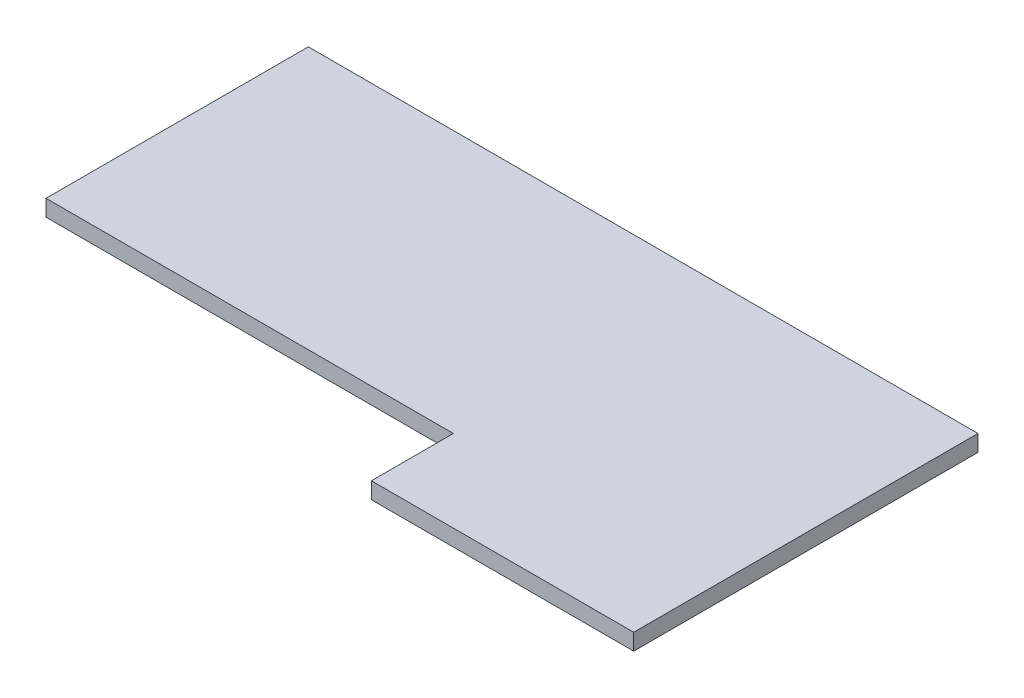
ISO-10303-21;
HEADER;
FILE_DESCRIPTION(('STEP AP214'),'2;1');
FILE_NAME('part.step','',(''),(''),'','','');
FILE_SCHEMA(('AUTOMOTIVE_DESIGN { 1 0 10303 214 1 1 1 1 }'));
ENDSEC;
DATA;
#1=APPLICATION_CONTEXT('core data for automotive mechanical design processes');
#2=APPLICATION_PROTOCOL_DEFINITION('international standard','automotive_design',2000,#1);
#3=PRODUCT_CONTEXT('',#1,'mechanical');
#4=PRODUCT('Part','Part','',(#3));
#5=PRODUCT_RELATED_PRODUCT_CATEGORY('part','',(#4));
#6=PRODUCT_DEFINITION_FORMATION('','',#4);
#7=PRODUCT_DEFINITION_CONTEXT('part definition',#1,'design');
#8=PRODUCT_DEFINITION('design','',#6,#7);
#9=PRODUCT_DEFINITION_SHAPE('','',#8);
#10=(LENGTH_UNIT() NAMED_UNIT(*) SI_UNIT(.MILLI.,.METRE.));
#11=(NAMED_UNIT(*) PLANE_ANGLE_UNIT() SI_UNIT($,.RADIAN.));
#12=(NAMED_UNIT(*) SI_UNIT($,.STERADIAN.) SOLID_ANGLE_UNIT());
#13=UNCERTAINTY_MEASURE_WITH_UNIT(LENGTH_MEASURE(1.E-05),#10,'distance_accuracy_value','');
#14=(GEOMETRIC_REPRESENTATION_CONTEXT(3) GLOBAL_UNCERTAINTY_ASSIGNED_CONTEXT((#13)) GLOBAL_UNIT_ASSIGNED_CONTEXT((#10,
#11,#12)) REPRESENTATION_CONTEXT('',''));
#15=CARTESIAN_POINT('',(0.,0.,0.));
#16=DIRECTION('',(0.,0.,1.));
#17=DIRECTION('',(1.,0.,0.));
#18=AXIS2_PLACEMENT_3D('',#15,#16,#17);
#19=CARTESIAN_POINT('',(-73.7839145142331,3.175,50.1154088181364));
#20=DIRECTION('',(1.,0.,0.));
#21=DIRECTION('',(0.,0.,-1.));
#22=AXIS2_PLACEMENT_3D('',#19,#20,#21);
#23=PLANE('',#22);
#24=DIRECTION('',(0.,0.,1.));
#25=VECTOR('',#24,1.);
#26=CARTESIAN_POINT('',(-73.7839145142331,0.,50.1154088181364));
#27=LINE('',#26,#25);
#28=CARTESIAN_POINT('',(-73.7839145142331,0.,-0.684591181863654));
#29=VERTEX_POINT('',#28);
#30=CARTESIAN_POINT('',(-73.7839145142331,0.,50.1154088181364));
#31=VERTEX_POINT('',#30);
#32=EDGE_CURVE('E129',#29,#31,#27,.T.);
#33=ORIENTED_EDGE('',*,*,#32,.T.);
#34=DIRECTION('',(0.,-1.,0.));
#35=VECTOR('',#34,1.);
#36=CARTESIAN_POINT('',(-73.7839145142331,3.175,50.1154088181364));
#37=LINE('',#36,#35);
#38=CARTESIAN_POINT('',(-73.7839145142331,3.175,50.1154088181364));
#39=VERTEX_POINT('',#38);
#40=EDGE_CURVE('E49',#39,#31,#37,.T.);
#41=ORIENTED_EDGE('',*,*,#40,.F.);
#42=DIRECTION('',(0.,0.,1.));
#43=VECTOR('',#42,1.);
#44=CARTESIAN_POINT('',(-73.7839145142331,3.175,50.1154088181364));
#45=LINE('',#44,#43);
#46=CARTESIAN_POINT('',(-73.7839145142331,3.175,-0.684591181863654));
#47=VERTEX_POINT('',#46);
#48=EDGE_CURVE('E95',#47,#39,#45,.T.);
#49=ORIENTED_EDGE('',*,*,#48,.F.);
#50=DIRECTION('',(0.,-1.,0.));
#51=VECTOR('',#50,1.);
#52=CARTESIAN_POINT('',(-73.7839145142331,3.175,-0.684591181863654));
#53=LINE('',#52,#51);
#54=EDGE_CURVE('E11',#47,#29,#53,.T.);
#55=ORIENTED_EDGE('',*,*,#54,.T.);
#56=EDGE_LOOP('',(#33,#41,#49,#55));
#57=FACE_BOUND('',#56,.T.);
#58=ADVANCED_FACE('F41',(#57),#23,.F.);
#59=CARTESIAN_POINT('',(5.0993337507725,3.175,50.1154088181364));
#60=DIRECTION('',(0.,0.,-1.));
#61=DIRECTION('',(-1.,0.,0.));
#62=AXIS2_PLACEMENT_3D('',#59,#60,#61);
#63=PLANE('',#62);
#64=DIRECTION('',(1.,0.,0.));
#65=VECTOR('',#64,1.);
#66=CARTESIAN_POINT('',(5.0993337507725,0.,50.1154088181364));
#67=LINE('',#66,#65);
#68=CARTESIAN_POINT('',(5.0993337507725,0.,50.1154088181364));
#69=VERTEX_POINT('',#68);
#70=EDGE_CURVE('E131',#31,#69,#67,.T.);
#71=ORIENTED_EDGE('',*,*,#70,.T.);
#72=DIRECTION('',(0.,-1.,0.));
#73=VECTOR('',#72,1.);
#74=CARTESIAN_POINT('',(5.0993337507725,3.175,50.1154088181364));
#75=LINE('',#74,#73);
#76=CARTESIAN_POINT('',(5.0993337507725,3.175,50.1154088181364));
#77=VERTEX_POINT('',#76);
#78=EDGE_CURVE('E118',#77,#69,#75,.T.);
#79=ORIENTED_EDGE('',*,*,#78,.F.);
#80=DIRECTION('',(1.,0.,0.));
#81=VECTOR('',#80,1.);
#82=CARTESIAN_POINT('',(5.0993337507725,3.175,50.1154088181364));
#83=LINE('',#82,#81);
#84=EDGE_CURVE('E109',#39,#77,#83,.T.);
#85=ORIENTED_EDGE('',*,*,#84,.F.);
#86=ORIENTED_EDGE('',*,*,#40,.T.);
#87=EDGE_LOOP('',(#71,#79,#85,#86));
#88=FACE_BOUND('',#87,.T.);
#89=ADVANCED_FACE('F143',(#88),#63,.F.);
#90=CARTESIAN_POINT('',(5.0993337507725,3.175,65.9904088181364));
#91=DIRECTION('',(1.,0.,0.));
#92=DIRECTION('',(0.,0.,-1.));
#93=AXIS2_PLACEMENT_3D('',#90,#91,#92);
#94=PLANE('',#93);
#95=DIRECTION('',(0.,0.,1.));
#96=VECTOR('',#95,1.);
#97=CARTESIAN_POINT('',(5.0993337507725,0.,65.9904088181364));
#98=LINE('',#97,#96);
#99=CARTESIAN_POINT('',(5.0993337507725,0.,65.9904088181364));
#100=VERTEX_POINT('',#99);
#101=EDGE_CURVE('E117',#69,#100,#98,.T.);
#102=ORIENTED_EDGE('',*,*,#101,.T.);
#103=DIRECTION('',(0.,-1.,0.));
#104=VECTOR('',#103,1.);
#105=CARTESIAN_POINT('',(5.0993337507725,3.175,65.9904088181364));
#106=LINE('',#105,#104);
#107=CARTESIAN_POINT('',(5.0993337507725,3.175,65.9904088181364));
#108=VERTEX_POINT('',#107);
#109=EDGE_CURVE('E114',#108,#100,#106,.T.);
#110=ORIENTED_EDGE('',*,*,#109,.F.);
#111=DIRECTION('',(0.,0.,1.));
#112=VECTOR('',#111,1.);
#113=CARTESIAN_POINT('',(5.0993337507725,3.175,65.9904088181364));
#114=LINE('',#113,#112);
#115=EDGE_CURVE('E103',#77,#108,#114,.T.);
#116=ORIENTED_EDGE('',*,*,#115,.F.);
#117=ORIENTED_EDGE('',*,*,#78,.T.);
#118=EDGE_LOOP('',(#102,#110,#116,#117));
#119=FACE_BOUND('',#118,.T.);
#120=ADVANCED_FACE('F115',(#119),#94,.F.);
#121=CARTESIAN_POINT('',(55.8993337507725,3.175,65.9904088181364));
#122=DIRECTION('',(0.,0.,-1.));
#123=DIRECTION('',(-1.,0.,0.));
#124=AXIS2_PLACEMENT_3D('',#121,#122,#123);
#125=PLANE('',#124);
#126=DIRECTION('',(1.,0.,0.));
#127=VECTOR('',#126,1.);
#128=CARTESIAN_POINT('',(55.8993337507725,0.,65.9904088181364));
#129=LINE('',#128,#127);
#130=CARTESIAN_POINT('',(55.8993337507725,0.,65.9904088181364));
#131=VERTEX_POINT('',#130);
#132=EDGE_CURVE('E81',#100,#131,#129,.T.);
#133=ORIENTED_EDGE('',*,*,#132,.T.);
#134=DIRECTION('',(0.,-1.,0.));
#135=VECTOR('',#134,1.);
#136=CARTESIAN_POINT('',(55.8993337507725,3.175,65.9904088181364));
#137=LINE('',#136,#135);
#138=CARTESIAN_POINT('',(55.8993337507725,3.175,65.9904088181364));
#139=VERTEX_POINT('',#138);
#140=EDGE_CURVE('E119',#139,#131,#137,.T.);
#141=ORIENTED_EDGE('',*,*,#140,.F.);
#142=DIRECTION('',(1.,0.,0.));
#143=VECTOR('',#142,1.);
#144=CARTESIAN_POINT('',(55.8993337507725,3.175,65.9904088181364));
#145=LINE('',#144,#143);
#146=EDGE_CURVE('E107',#108,#139,#145,.T.);
#147=ORIENTED_EDGE('',*,*,#146,.F.);
#148=ORIENTED_EDGE('',*,*,#109,.T.);
#149=EDGE_LOOP('',(#133,#141,#147,#148));
#150=FACE_BOUND('',#149,.T.);
#151=ADVANCED_FACE('F121',(#150),#125,.F.);
#152=CARTESIAN_POINT('',(55.8993337507725,3.175,-0.684591181863634));
#153=DIRECTION('',(-1.,0.,0.));
#154=DIRECTION('',(0.,0.,1.));
#155=AXIS2_PLACEMENT_3D('',#152,#153,#154);
#156=PLANE('',#155);
#157=DIRECTION('',(0.,0.,-1.));
#158=VECTOR('',#157,1.);
#159=CARTESIAN_POINT('',(55.8993337507725,0.,-0.684591181863634));
#160=LINE('',#159,#158);
#161=CARTESIAN_POINT('',(55.8993337507725,0.,-0.684591181863634));
#162=VERTEX_POINT('',#161);
#163=EDGE_CURVE('E88',#131,#162,#160,.T.);
#164=ORIENTED_EDGE('',*,*,#163,.T.);
#165=DIRECTION('',(0.,-1.,0.));
#166=VECTOR('',#165,1.);
#167=CARTESIAN_POINT('',(55.8993337507725,3.175,-0.684591181863634));
#168=LINE('',#167,#166);
#169=CARTESIAN_POINT('',(55.8993337507725,3.175,-0.684591181863634));
#170=VERTEX_POINT('',#169);
#171=EDGE_CURVE('E125',#170,#162,#168,.T.);
#172=ORIENTED_EDGE('',*,*,#171,.F.);
#173=DIRECTION('',(0.,0.,-1.));
#174=VECTOR('',#173,1.);
#175=CARTESIAN_POINT('',(55.8993337507725,3.175,-0.684591181863634));
#176=LINE('',#175,#174);
#177=EDGE_CURVE('E123',#139,#170,#176,.T.);
#178=ORIENTED_EDGE('',*,*,#177,.F.);
#179=ORIENTED_EDGE('',*,*,#140,.T.);
#180=EDGE_LOOP('',(#164,#172,#178,#179));
#181=FACE_BOUND('',#180,.T.);
#182=ADVANCED_FACE('F149',(#181),#156,.F.);
#183=CARTESIAN_POINT('',(5.0993337507725,3.175,-0.684591181863634));
#184=DIRECTION('',(0.,0.,1.));
#185=DIRECTION('',(1.,0.,0.));
#186=AXIS2_PLACEMENT_3D('',#183,#184,#185);
#187=PLANE('',#186);
#188=DIRECTION('',(-1.,0.,0.));
#189=VECTOR('',#188,1.);
#190=CARTESIAN_POINT('',(5.0993337507725,0.,-0.684591181863634));
#191=LINE('',#190,#189);
#192=EDGE_CURVE('E136',#162,#29,#191,.T.);
#193=ORIENTED_EDGE('',*,*,#192,.T.);
#194=ORIENTED_EDGE('',*,*,#54,.F.);
#195=DIRECTION('',(-1.,0.,0.));
#196=VECTOR('',#195,1.);
#197=CARTESIAN_POINT('',(-73.7839145142331,3.175,-0.684591181863654));
#198=LINE('',#197,#196);
#199=EDGE_CURVE('E57',#170,#47,#198,.T.);
#200=ORIENTED_EDGE('',*,*,#199,.F.);
#201=ORIENTED_EDGE('',*,*,#171,.T.);
#202=EDGE_LOOP('',(#193,#194,#200,#201));
#203=FACE_BOUND('',#202,.T.);
#204=ADVANCED_FACE('F148',(#203),#187,.F.);
#205=CARTESIAN_POINT('',(0.,3.175,0.));
#206=DIRECTION('',(0.,-1.,0.));
#207=DIRECTION('',(0.,0.,-1.));
#208=AXIS2_PLACEMENT_3D('',#205,#206,#207);
#209=PLANE('',#208);
#210=ORIENTED_EDGE('',*,*,#199,.T.);
#211=ORIENTED_EDGE('',*,*,#48,.T.);
#212=ORIENTED_EDGE('',*,*,#84,.T.);
#213=ORIENTED_EDGE('',*,*,#115,.T.);
#214=ORIENTED_EDGE('',*,*,#146,.T.);
#215=ORIENTED_EDGE('',*,*,#177,.T.);
#216=EDGE_LOOP('',(#210,#211,#212,#213,#214,#215));
#217=FACE_BOUND('',#216,.T.);
#218=ADVANCED_FACE('F105',(#217),#209,.F.);
#219=CARTESIAN_POINT('',(0.,0.,0.));
#220=DIRECTION('',(0.,-1.,0.));
#221=DIRECTION('',(0.,0.,-1.));
#222=AXIS2_PLACEMENT_3D('',#219,#220,#221);
#223=PLANE('',#222);
#224=ORIENTED_EDGE('',*,*,#32,.F.);
#225=ORIENTED_EDGE('',*,*,#192,.F.);
#226=ORIENTED_EDGE('',*,*,#163,.F.);
#227=ORIENTED_EDGE('',*,*,#132,.F.);
#228=ORIENTED_EDGE('',*,*,#101,.F.);
#229=ORIENTED_EDGE('',*,*,#70,.F.);
#230=EDGE_LOOP('',(#224,#225,#226,#227,#228,#229));
#231=FACE_BOUND('',#230,.T.);
#232=ADVANCED_FACE('F146',(#231),#223,.T.);
#233=CLOSED_SHELL('',(#58,#89,#120,#151,#182,#204,#218,#232));
#234=MANIFOLD_SOLID_BREP('B2',#233);
#235=ADVANCED_BREP_SHAPE_REPRESENTATION('',(#18,#234),#14);
#236=SHAPE_DEFINITION_REPRESENTATION(#9,#235);
ENDSEC;
END-ISO-10303-21;
